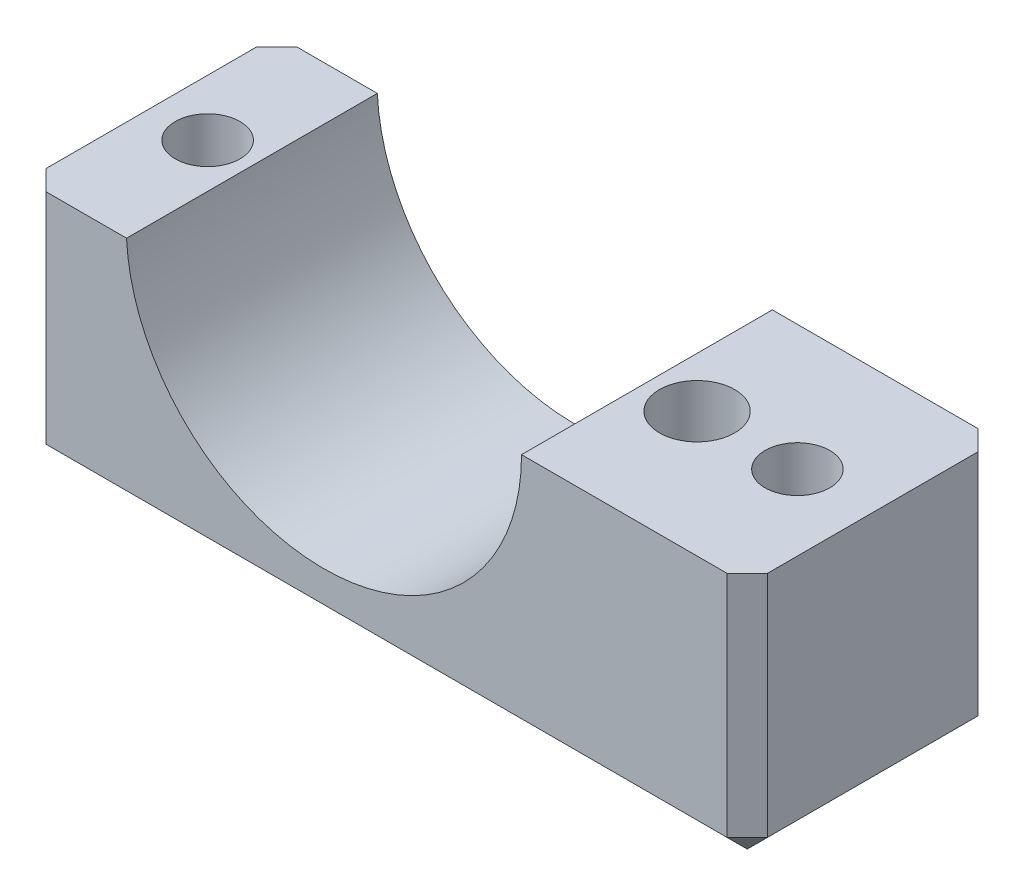
ISO-10303-21;
HEADER;
FILE_DESCRIPTION(('STEP AP214'),'2;1');
FILE_NAME('part.step','',(''),(''),'','','');
FILE_SCHEMA(('AUTOMOTIVE_DESIGN { 1 0 10303 214 1 1 1 1 }'));
ENDSEC;
DATA;
#1=APPLICATION_CONTEXT('core data for automotive mechanical design processes');
#2=APPLICATION_PROTOCOL_DEFINITION('international standard','automotive_design',2000,#1);
#3=PRODUCT_CONTEXT('',#1,'mechanical');
#4=PRODUCT('Part','Part','',(#3));
#5=PRODUCT_RELATED_PRODUCT_CATEGORY('part','',(#4));
#6=PRODUCT_DEFINITION_FORMATION('','',#4);
#7=PRODUCT_DEFINITION_CONTEXT('part definition',#1,'design');
#8=PRODUCT_DEFINITION('design','',#6,#7);
#9=PRODUCT_DEFINITION_SHAPE('','',#8);
#10=(LENGTH_UNIT() NAMED_UNIT(*) SI_UNIT(.MILLI.,.METRE.));
#11=(NAMED_UNIT(*) PLANE_ANGLE_UNIT() SI_UNIT($,.RADIAN.));
#12=(NAMED_UNIT(*) SI_UNIT($,.STERADIAN.) SOLID_ANGLE_UNIT());
#13=UNCERTAINTY_MEASURE_WITH_UNIT(LENGTH_MEASURE(1.E-05),#10,'distance_accuracy_value','');
#14=(GEOMETRIC_REPRESENTATION_CONTEXT(3) GLOBAL_UNCERTAINTY_ASSIGNED_CONTEXT((#13)) GLOBAL_UNIT_ASSIGNED_CONTEXT((#10,
#11,#12)) REPRESENTATION_CONTEXT('',''));
#15=CARTESIAN_POINT('',(0.,0.,0.));
#16=DIRECTION('',(0.,0.,1.));
#17=DIRECTION('',(1.,0.,0.));
#18=AXIS2_PLACEMENT_3D('',#15,#16,#17);
#19=CARTESIAN_POINT('',(0.,-31.496,31.75));
#20=DIRECTION('',(1.,0.,0.));
#21=DIRECTION('',(0.,0.,-1.));
#22=AXIS2_PLACEMENT_3D('',#19,#20,#21);
#23=PLANE('',#22);
#24=DIRECTION('',(0.,0.,1.));
#25=VECTOR('',#24,1.);
#26=CARTESIAN_POINT('',(0.,-28.956,31.75));
#27=LINE('',#26,#25);
#28=CARTESIAN_POINT('',(0.,-28.956,2.53999999999999));
#29=VERTEX_POINT('',#28);
#30=CARTESIAN_POINT('',(0.,-28.956,29.21));
#31=VERTEX_POINT('',#30);
#32=EDGE_CURVE('E211',#29,#31,#27,.T.);
#33=ORIENTED_EDGE('',*,*,#32,.T.);
#34=DIRECTION('',(0.,1.,0.));
#35=VECTOR('',#34,1.);
#36=CARTESIAN_POINT('',(0.,-1.27,29.21));
#37=LINE('',#36,#35);
#38=CARTESIAN_POINT('',(0.,-1.27,29.21));
#39=VERTEX_POINT('',#38);
#40=EDGE_CURVE('E214',#31,#39,#37,.T.);
#41=ORIENTED_EDGE('',*,*,#40,.T.);
#42=DIRECTION('',(0.,0.,1.));
#43=VECTOR('',#42,1.);
#44=CARTESIAN_POINT('',(0.,-1.27,31.75));
#45=LINE('',#44,#43);
#46=CARTESIAN_POINT('',(0.,-1.27,2.53999999999999));
#47=VERTEX_POINT('',#46);
#48=EDGE_CURVE('E149',#47,#39,#45,.T.);
#49=ORIENTED_EDGE('',*,*,#48,.F.);
#50=DIRECTION('',(0.,-1.,0.));
#51=VECTOR('',#50,1.);
#52=CARTESIAN_POINT('',(0.,-31.496,2.53999999999999));
#53=LINE('',#52,#51);
#54=EDGE_CURVE('E209',#47,#29,#53,.T.);
#55=ORIENTED_EDGE('',*,*,#54,.T.);
#56=EDGE_LOOP('',(#33,#41,#49,#55));
#57=FACE_BOUND('',#56,.T.);
#58=ADVANCED_FACE('F41',(#57),#23,.F.);
#59=CARTESIAN_POINT('',(91.313,-31.496,31.75));
#60=DIRECTION('',(0.,1.,0.));
#61=DIRECTION('',(-1.,0.,0.));
#62=AXIS2_PLACEMENT_3D('',#59,#60,#61);
#63=PLANE('',#62);
#64=CARTESIAN_POINT('',(69.088,-31.496,15.875));
#65=DIRECTION('',(0.,-1.,0.));
#66=DIRECTION('',(0.,0.,-1.));
#67=AXIS2_PLACEMENT_3D('',#64,#65,#66);
#68=CIRCLE('',#67,4.76249999999999);
#69=CARTESIAN_POINT('',(69.088,-31.496,11.1125));
#70=VERTEX_POINT('',#69);
#71=EDGE_CURVE('E159',#70,#70,#68,.T.);
#72=ORIENTED_EDGE('',*,*,#71,.F.);
#73=EDGE_LOOP('',(#72));
#74=FACE_BOUND('',#73,.T.);
#75=DIRECTION('',(-1.,0.,0.));
#76=VECTOR('',#75,1.);
#77=CARTESIAN_POINT('',(0.,-31.496,29.21));
#78=LINE('',#77,#76);
#79=CARTESIAN_POINT('',(88.773,-31.496,29.21));
#80=VERTEX_POINT('',#79);
#81=CARTESIAN_POINT('',(2.53999999999999,-31.496,29.21));
#82=VERTEX_POINT('',#81);
#83=EDGE_CURVE('E198',#80,#82,#78,.T.);
#84=ORIENTED_EDGE('',*,*,#83,.T.);
#85=DIRECTION('',(0.,0.,-1.));
#86=VECTOR('',#85,1.);
#87=CARTESIAN_POINT('',(2.53999999999999,-31.496,31.75));
#88=LINE('',#87,#86);
#89=CARTESIAN_POINT('',(2.53999999999999,-31.496,20.2685209012818));
#90=VERTEX_POINT('',#89);
#91=EDGE_CURVE('E200',#82,#90,#88,.T.);
#92=ORIENTED_EDGE('',*,*,#91,.T.);
#93=CARTESIAN_POINT('',(7.12470000000001,-31.496,15.875));
#94=DIRECTION('',(0.,-1.,0.));
#95=DIRECTION('',(0.,0.,-1.));
#96=AXIS2_PLACEMENT_3D('',#93,#94,#95);
#97=CIRCLE('',#96,6.35);
#98=CARTESIAN_POINT('',(2.53999999999999,-31.496,11.4814790987182));
#99=VERTEX_POINT('',#98);
#100=EDGE_CURVE('E272',#99,#90,#97,.T.);
#101=ORIENTED_EDGE('',*,*,#100,.F.);
#102=DIRECTION('',(0.,0.,-1.));
#103=VECTOR('',#102,1.);
#104=CARTESIAN_POINT('',(2.53999999999999,-31.496,31.75));
#105=LINE('',#104,#103);
#106=CARTESIAN_POINT('',(2.53999999999999,-31.496,2.53999999999999));
#107=VERTEX_POINT('',#106);
#108=EDGE_CURVE('E192',#99,#107,#105,.T.);
#109=ORIENTED_EDGE('',*,*,#108,.T.);
#110=DIRECTION('',(1.,0.,0.));
#111=VECTOR('',#110,1.);
#112=CARTESIAN_POINT('',(91.313,-31.496,2.53999999999999));
#113=LINE('',#112,#111);
#114=CARTESIAN_POINT('',(88.773,-31.496,2.53999999999999));
#115=VERTEX_POINT('',#114);
#116=EDGE_CURVE('E189',#107,#115,#113,.T.);
#117=ORIENTED_EDGE('',*,*,#116,.T.);
#118=DIRECTION('',(0.,0.,1.));
#119=VECTOR('',#118,1.);
#120=CARTESIAN_POINT('',(88.773,-31.496,31.75));
#121=LINE('',#120,#119);
#122=EDGE_CURVE('E195',#115,#80,#121,.T.);
#123=ORIENTED_EDGE('',*,*,#122,.T.);
#124=EDGE_LOOP('',(#84,#92,#101,#109,#117,#123));
#125=FACE_BOUND('',#124,.T.);
#126=CARTESIAN_POINT('',(81.788,-31.496,15.875));
#127=DIRECTION('',(0.,-1.,0.));
#128=DIRECTION('',(0.,0.,-1.));
#129=AXIS2_PLACEMENT_3D('',#126,#127,#128);
#130=CIRCLE('',#129,6.34999999999999);
#131=CARTESIAN_POINT('',(81.788,-31.496,9.525));
#132=VERTEX_POINT('',#131);
#133=EDGE_CURVE('E284',#132,#132,#130,.T.);
#134=ORIENTED_EDGE('',*,*,#133,.F.);
#135=EDGE_LOOP('',(#134));
#136=FACE_BOUND('',#135,.T.);
#137=ADVANCED_FACE('F318',(#74,#125,#136),#63,.F.);
#138=CARTESIAN_POINT('',(91.313,0.,31.75));
#139=DIRECTION('',(-1.,0.,0.));
#140=DIRECTION('',(0.,0.,1.));
#141=AXIS2_PLACEMENT_3D('',#138,#139,#140);
#142=PLANE('',#141);
#143=DIRECTION('',(0.,0.,-1.));
#144=VECTOR('',#143,1.);
#145=CARTESIAN_POINT('',(91.313,0.,31.75));
#146=LINE('',#145,#144);
#147=CARTESIAN_POINT('',(91.313,0.,29.21));
#148=VERTEX_POINT('',#147);
#149=CARTESIAN_POINT('',(91.313,0.,2.53999999999999));
#150=VERTEX_POINT('',#149);
#151=EDGE_CURVE('E168',#148,#150,#146,.T.);
#152=ORIENTED_EDGE('',*,*,#151,.F.);
#153=DIRECTION('',(0.,-1.,0.));
#154=VECTOR('',#153,1.);
#155=CARTESIAN_POINT('',(91.313,-31.496,29.21));
#156=LINE('',#155,#154);
#157=CARTESIAN_POINT('',(91.313,-28.956,29.21));
#158=VERTEX_POINT('',#157);
#159=EDGE_CURVE('E187',#148,#158,#156,.T.);
#160=ORIENTED_EDGE('',*,*,#159,.T.);
#161=DIRECTION('',(0.,0.,-1.));
#162=VECTOR('',#161,1.);
#163=CARTESIAN_POINT('',(91.313,-28.956,31.75));
#164=LINE('',#163,#162);
#165=CARTESIAN_POINT('',(91.313,-28.956,2.53999999999999));
#166=VERTEX_POINT('',#165);
#167=EDGE_CURVE('E184',#158,#166,#164,.T.);
#168=ORIENTED_EDGE('',*,*,#167,.T.);
#169=DIRECTION('',(0.,1.,0.));
#170=VECTOR('',#169,1.);
#171=CARTESIAN_POINT('',(91.313,0.,2.53999999999999));
#172=LINE('',#171,#170);
#173=EDGE_CURVE('E180',#166,#150,#172,.T.);
#174=ORIENTED_EDGE('',*,*,#173,.T.);
#175=EDGE_LOOP('',(#152,#160,#168,#174));
#176=FACE_BOUND('',#175,.T.);
#177=ADVANCED_FACE('F320',(#176),#142,.F.);
#178=CARTESIAN_POINT('',(62.738,0.,31.75));
#179=DIRECTION('',(0.,-1.,0.));
#180=DIRECTION('',(0.,0.,-1.));
#181=AXIS2_PLACEMENT_3D('',#178,#179,#180);
#182=PLANE('',#181);
#183=CARTESIAN_POINT('',(69.088,0.,15.875));
#184=DIRECTION('',(0.,-1.,0.));
#185=DIRECTION('',(0.,0.,-1.));
#186=AXIS2_PLACEMENT_3D('',#183,#184,#185);
#187=CIRCLE('',#186,4.76249999999999);
#188=CARTESIAN_POINT('',(69.088,0.,11.1125));
#189=VERTEX_POINT('',#188);
#190=EDGE_CURVE('E269',#189,#189,#187,.T.);
#191=ORIENTED_EDGE('',*,*,#190,.T.);
#192=EDGE_LOOP('',(#191));
#193=FACE_BOUND('',#192,.T.);
#194=CARTESIAN_POINT('',(81.788,0.,15.875));
#195=DIRECTION('',(0.,-1.,0.));
#196=DIRECTION('',(0.,0.,-1.));
#197=AXIS2_PLACEMENT_3D('',#194,#195,#196);
#198=CIRCLE('',#197,4.1021);
#199=CARTESIAN_POINT('',(81.788,0.,11.7729));
#200=VERTEX_POINT('',#199);
#201=EDGE_CURVE('E175',#200,#200,#198,.T.);
#202=ORIENTED_EDGE('',*,*,#201,.T.);
#203=EDGE_LOOP('',(#202));
#204=FACE_BOUND('',#203,.T.);
#205=DIRECTION('',(-1.,0.,0.));
#206=VECTOR('',#205,1.);
#207=CARTESIAN_POINT('',(62.738,0.,31.75));
#208=LINE('',#207,#206);
#209=CARTESIAN_POINT('',(88.773,0.,31.75));
#210=VERTEX_POINT('',#209);
#211=CARTESIAN_POINT('',(62.738,0.,31.75));
#212=VERTEX_POINT('',#211);
#213=EDGE_CURVE('E164',#210,#212,#208,.T.);
#214=ORIENTED_EDGE('',*,*,#213,.F.);
#215=DIRECTION('',(0.707106781186549,0.,-0.707106781186546));
#216=VECTOR('',#215,1.);
#217=CARTESIAN_POINT('',(88.773,0.,31.75));
#218=LINE('',#217,#216);
#219=EDGE_CURVE('E221',#210,#148,#218,.T.);
#220=ORIENTED_EDGE('',*,*,#219,.T.);
#221=ORIENTED_EDGE('',*,*,#151,.T.);
#222=DIRECTION('',(0.707106781186549,0.,0.707106781186546));
#223=VECTOR('',#222,1.);
#224=CARTESIAN_POINT('',(91.313,0.,2.53999999999999));
#225=LINE('',#224,#223);
#226=CARTESIAN_POINT('',(88.773,0.,0.));
#227=VERTEX_POINT('',#226);
#228=EDGE_CURVE('E219',#150,#227,#225,.F.);
#229=ORIENTED_EDGE('',*,*,#228,.T.);
#230=DIRECTION('',(-1.,0.,0.));
#231=VECTOR('',#230,1.);
#232=CARTESIAN_POINT('',(62.738,0.,0.));
#233=LINE('',#232,#231);
#234=CARTESIAN_POINT('',(62.738,0.,0.));
#235=VERTEX_POINT('',#234);
#236=EDGE_CURVE('E173',#227,#235,#233,.T.);
#237=ORIENTED_EDGE('',*,*,#236,.T.);
#238=DIRECTION('',(0.,0.,-1.));
#239=VECTOR('',#238,1.);
#240=CARTESIAN_POINT('',(62.738,0.,31.75));
#241=LINE('',#240,#239);
#242=EDGE_CURVE('E166',#212,#235,#241,.T.);
#243=ORIENTED_EDGE('',*,*,#242,.F.);
#244=EDGE_LOOP('',(#214,#220,#221,#229,#237,#243));
#245=FACE_BOUND('',#244,.T.);
#246=ADVANCED_FACE('F295',(#193,#204,#245),#182,.F.);
#247=CARTESIAN_POINT('',(37.719,0.,31.75));
#248=DIRECTION('',(0.,0.,-1.));
#249=DIRECTION('',(-1.,0.,0.));
#250=AXIS2_PLACEMENT_3D('',#247,#248,#249);
#251=CYLINDRICAL_SURFACE('',#250,25.019);
#252=CARTESIAN_POINT('',(37.719,0.,0.));
#253=DIRECTION('',(0.,0.,-1.));
#254=DIRECTION('',(1.,0.,0.));
#255=AXIS2_PLACEMENT_3D('',#252,#253,#254);
#256=CIRCLE('',#255,25.019);
#257=CARTESIAN_POINT('',(12.7322542935259,-1.27,0.));
#258=VERTEX_POINT('',#257);
#259=EDGE_CURVE('E158',#235,#258,#256,.T.);
#260=ORIENTED_EDGE('',*,*,#259,.T.);
#261=DIRECTION('',(0.,0.,-1.));
#262=VECTOR('',#261,1.);
#263=CARTESIAN_POINT('',(12.7322542935259,-1.27,31.75));
#264=LINE('',#263,#262);
#265=CARTESIAN_POINT('',(12.7322542935259,-1.27,31.75));
#266=VERTEX_POINT('',#265);
#267=EDGE_CURVE('E141',#258,#266,#264,.F.);
#268=ORIENTED_EDGE('',*,*,#267,.T.);
#269=CARTESIAN_POINT('',(37.719,0.,31.75));
#270=DIRECTION('',(0.,0.,-1.));
#271=DIRECTION('',(1.,0.,0.));
#272=AXIS2_PLACEMENT_3D('',#269,#270,#271);
#273=CIRCLE('',#272,25.019);
#274=EDGE_CURVE('E156',#212,#266,#273,.T.);
#275=ORIENTED_EDGE('',*,*,#274,.F.);
#276=ORIENTED_EDGE('',*,*,#242,.T.);
#277=EDGE_LOOP('',(#260,#268,#275,#276));
#278=FACE_BOUND('',#277,.T.);
#279=ADVANCED_FACE('F154',(#278),#251,.F.);
#280=CARTESIAN_POINT('',(37.719,0.,31.75));
#281=DIRECTION('',(0.,0.,1.));
#282=DIRECTION('',(1.,0.,0.));
#283=AXIS2_PLACEMENT_3D('',#280,#281,#282);
#284=PLANE('',#283);
#285=DIRECTION('',(1.,0.,0.));
#286=VECTOR('',#285,1.);
#287=CARTESIAN_POINT('',(0.,-1.27,31.75));
#288=LINE('',#287,#286);
#289=CARTESIAN_POINT('',(2.53999999999999,-1.27,31.75));
#290=VERTEX_POINT('',#289);
#291=EDGE_CURVE('E136',#290,#266,#288,.T.);
#292=ORIENTED_EDGE('',*,*,#291,.F.);
#293=DIRECTION('',(0.,-1.,0.));
#294=VECTOR('',#293,1.);
#295=CARTESIAN_POINT('',(2.53999999999999,-31.496,31.75));
#296=LINE('',#295,#294);
#297=CARTESIAN_POINT('',(2.53999999999999,-28.956,31.75));
#298=VERTEX_POINT('',#297);
#299=EDGE_CURVE('E207',#290,#298,#296,.T.);
#300=ORIENTED_EDGE('',*,*,#299,.T.);
#301=DIRECTION('',(1.,0.,0.));
#302=VECTOR('',#301,1.);
#303=CARTESIAN_POINT('',(91.313,-28.956,31.75));
#304=LINE('',#303,#302);
#305=CARTESIAN_POINT('',(88.773,-28.956,31.75));
#306=VERTEX_POINT('',#305);
#307=EDGE_CURVE('E203',#298,#306,#304,.T.);
#308=ORIENTED_EDGE('',*,*,#307,.T.);
#309=DIRECTION('',(0.,1.,0.));
#310=VECTOR('',#309,1.);
#311=CARTESIAN_POINT('',(88.773,0.,31.75));
#312=LINE('',#311,#310);
#313=EDGE_CURVE('E205',#306,#210,#312,.T.);
#314=ORIENTED_EDGE('',*,*,#313,.T.);
#315=ORIENTED_EDGE('',*,*,#213,.T.);
#316=ORIENTED_EDGE('',*,*,#274,.T.);
#317=EDGE_LOOP('',(#292,#300,#308,#314,#315,#316));
#318=FACE_BOUND('',#317,.T.);
#319=ADVANCED_FACE('F162',(#318),#284,.T.);
#320=CARTESIAN_POINT('',(37.719,0.,0.));
#321=DIRECTION('',(0.,0.,1.));
#322=DIRECTION('',(1.,0.,0.));
#323=AXIS2_PLACEMENT_3D('',#320,#321,#322);
#324=PLANE('',#323);
#325=DIRECTION('',(-1.,0.,0.));
#326=VECTOR('',#325,1.);
#327=CARTESIAN_POINT('',(37.719,-28.956,0.));
#328=LINE('',#327,#326);
#329=CARTESIAN_POINT('',(88.773,-28.956,0.));
#330=VERTEX_POINT('',#329);
#331=CARTESIAN_POINT('',(2.54,-28.956,0.));
#332=VERTEX_POINT('',#331);
#333=EDGE_CURVE('E50',#330,#332,#328,.T.);
#334=ORIENTED_EDGE('',*,*,#333,.T.);
#335=DIRECTION('',(0.,1.,0.));
#336=VECTOR('',#335,1.);
#337=CARTESIAN_POINT('',(2.54,0.,0.));
#338=LINE('',#337,#336);
#339=CARTESIAN_POINT('',(2.54,-1.27,0.));
#340=VERTEX_POINT('',#339);
#341=EDGE_CURVE('E11',#332,#340,#338,.T.);
#342=ORIENTED_EDGE('',*,*,#341,.T.);
#343=DIRECTION('',(-1.,0.,0.));
#344=VECTOR('',#343,1.);
#345=CARTESIAN_POINT('',(0.,-1.27,0.));
#346=LINE('',#345,#344);
#347=EDGE_CURVE('E148',#258,#340,#346,.T.);
#348=ORIENTED_EDGE('',*,*,#347,.F.);
#349=ORIENTED_EDGE('',*,*,#259,.F.);
#350=ORIENTED_EDGE('',*,*,#236,.F.);
#351=DIRECTION('',(0.,-1.,0.));
#352=VECTOR('',#351,1.);
#353=CARTESIAN_POINT('',(88.773,0.,0.));
#354=LINE('',#353,#352);
#355=EDGE_CURVE('E61',#227,#330,#354,.T.);
#356=ORIENTED_EDGE('',*,*,#355,.T.);
#357=EDGE_LOOP('',(#334,#342,#348,#349,#350,#356));
#358=FACE_BOUND('',#357,.T.);
#359=ADVANCED_FACE('F302',(#358),#324,.F.);
#360=CARTESIAN_POINT('',(81.788,-31.496,15.875));
#361=DIRECTION('',(0.,-1.,0.));
#362=DIRECTION('',(0.,0.,-1.));
#363=AXIS2_PLACEMENT_3D('',#360,#361,#362);
#364=CYLINDRICAL_SURFACE('',#363,4.1021);
#365=ORIENTED_EDGE('',*,*,#201,.F.);
#366=EDGE_LOOP('',(#365));
#367=FACE_BOUND('',#366,.T.);
#368=CARTESIAN_POINT('',(81.788,-21.971,15.875));
#369=DIRECTION('',(0.,-1.,0.));
#370=DIRECTION('',(0.,0.,-1.));
#371=AXIS2_PLACEMENT_3D('',#368,#369,#370);
#372=CIRCLE('',#371,4.1021);
#373=CARTESIAN_POINT('',(81.788,-21.971,11.7729));
#374=VERTEX_POINT('',#373);
#375=EDGE_CURVE('E290',#374,#374,#372,.T.);
#376=ORIENTED_EDGE('',*,*,#375,.T.);
#377=EDGE_LOOP('',(#376));
#378=FACE_BOUND('',#377,.T.);
#379=ADVANCED_FACE('F298',(#367,#378),#364,.F.);
#380=CARTESIAN_POINT('',(85.8901,-21.971,15.875));
#381=DIRECTION('',(0.,1.,0.));
#382=DIRECTION('',(0.,0.,1.));
#383=AXIS2_PLACEMENT_3D('',#380,#381,#382);
#384=PLANE('',#383);
#385=ORIENTED_EDGE('',*,*,#375,.F.);
#386=EDGE_LOOP('',(#385));
#387=FACE_BOUND('',#386,.T.);
#388=CARTESIAN_POINT('',(81.788,-21.971,15.875));
#389=DIRECTION('',(0.,-1.,0.));
#390=DIRECTION('',(0.,0.,-1.));
#391=AXIS2_PLACEMENT_3D('',#388,#389,#390);
#392=CIRCLE('',#391,6.34999999999999);
#393=CARTESIAN_POINT('',(81.788,-21.971,9.525));
#394=VERTEX_POINT('',#393);
#395=EDGE_CURVE('E287',#394,#394,#392,.T.);
#396=ORIENTED_EDGE('',*,*,#395,.T.);
#397=EDGE_LOOP('',(#396));
#398=FACE_BOUND('',#397,.T.);
#399=ADVANCED_FACE('F301',(#387,#398),#384,.F.);
#400=CARTESIAN_POINT('',(81.788,-31.496,15.875));
#401=DIRECTION('',(0.,-1.,0.));
#402=DIRECTION('',(0.,0.,-1.));
#403=AXIS2_PLACEMENT_3D('',#400,#401,#402);
#404=CYLINDRICAL_SURFACE('',#403,6.34999999999999);
#405=ORIENTED_EDGE('',*,*,#395,.F.);
#406=EDGE_LOOP('',(#405));
#407=FACE_BOUND('',#406,.T.);
#408=ORIENTED_EDGE('',*,*,#133,.T.);
#409=EDGE_LOOP('',(#408));
#410=FACE_BOUND('',#409,.T.);
#411=ADVANCED_FACE('F308',(#407,#410),#404,.F.);
#412=CARTESIAN_POINT('',(7.12470000000001,-31.496,15.875));
#413=DIRECTION('',(0.,-1.,0.));
#414=DIRECTION('',(0.,0.,-1.));
#415=AXIS2_PLACEMENT_3D('',#412,#413,#414);
#416=CYLINDRICAL_SURFACE('',#415,4.1021);
#417=CARTESIAN_POINT('',(7.12470000000001,-1.27,15.875));
#418=DIRECTION('',(0.,-1.,0.));
#419=DIRECTION('',(0.,0.,-1.));
#420=AXIS2_PLACEMENT_3D('',#417,#418,#419);
#421=CIRCLE('',#420,4.1021);
#422=CARTESIAN_POINT('',(7.12470000000001,-1.27,11.7729));
#423=VERTEX_POINT('',#422);
#424=EDGE_CURVE('E160',#423,#423,#421,.F.);
#425=ORIENTED_EDGE('',*,*,#424,.T.);
#426=EDGE_LOOP('',(#425));
#427=FACE_BOUND('',#426,.T.);
#428=CARTESIAN_POINT('',(7.12470000000001,-21.971,15.875));
#429=DIRECTION('',(0.,-1.,0.));
#430=DIRECTION('',(0.,0.,-1.));
#431=AXIS2_PLACEMENT_3D('',#428,#429,#430);
#432=CIRCLE('',#431,4.1021);
#433=CARTESIAN_POINT('',(7.12470000000001,-21.971,11.7729));
#434=VERTEX_POINT('',#433);
#435=EDGE_CURVE('E280',#434,#434,#432,.T.);
#436=ORIENTED_EDGE('',*,*,#435,.T.);
#437=EDGE_LOOP('',(#436));
#438=FACE_BOUND('',#437,.T.);
#439=ADVANCED_FACE('F314',(#427,#438),#416,.F.);
#440=CARTESIAN_POINT('',(11.2268,-21.971,15.875));
#441=DIRECTION('',(0.,1.,0.));
#442=DIRECTION('',(0.,0.,1.));
#443=AXIS2_PLACEMENT_3D('',#440,#441,#442);
#444=PLANE('',#443);
#445=ORIENTED_EDGE('',*,*,#435,.F.);
#446=EDGE_LOOP('',(#445));
#447=FACE_BOUND('',#446,.T.);
#448=CARTESIAN_POINT('',(7.12470000000001,-21.971,15.875));
#449=DIRECTION('',(0.,-1.,0.));
#450=DIRECTION('',(0.,0.,-1.));
#451=AXIS2_PLACEMENT_3D('',#448,#449,#450);
#452=CIRCLE('',#451,6.35);
#453=CARTESIAN_POINT('',(7.12470000000001,-21.971,9.525));
#454=VERTEX_POINT('',#453);
#455=EDGE_CURVE('E276',#454,#454,#452,.T.);
#456=ORIENTED_EDGE('',*,*,#455,.T.);
#457=EDGE_LOOP('',(#456));
#458=FACE_BOUND('',#457,.T.);
#459=ADVANCED_FACE('F395',(#447,#458),#444,.F.);
#460=CARTESIAN_POINT('',(7.12470000000001,-31.496,15.875));
#461=DIRECTION('',(0.,-1.,0.));
#462=DIRECTION('',(0.,0.,-1.));
#463=AXIS2_PLACEMENT_3D('',#460,#461,#462);
#464=CYLINDRICAL_SURFACE('',#463,6.35);
#465=ORIENTED_EDGE('',*,*,#455,.F.);
#466=EDGE_LOOP('',(#465));
#467=FACE_BOUND('',#466,.T.);
#468=ORIENTED_EDGE('',*,*,#100,.T.);
#469=CARTESIAN_POINT('',(7.12470000000001,-36.0807,15.875));
#470=DIRECTION('',(0.707106781186549,0.707106781186546,0.));
#471=DIRECTION('',(0.707106781186546,-0.707106781186549,0.));
#472=AXIS2_PLACEMENT_3D('',#469,#470,#471);
#473=ELLIPSE('',#472,8.98025612106918,6.35);
#474=EDGE_CURVE('E223',#90,#99,#473,.F.);
#475=ORIENTED_EDGE('',*,*,#474,.T.);
#476=EDGE_LOOP('',(#468,#475));
#477=FACE_BOUND('',#476,.T.);
#478=ADVANCED_FACE('F392',(#467,#477),#464,.F.);
#479=CARTESIAN_POINT('',(69.088,-31.496,15.875));
#480=DIRECTION('',(0.,-1.,0.));
#481=DIRECTION('',(0.,0.,-1.));
#482=AXIS2_PLACEMENT_3D('',#479,#480,#481);
#483=CYLINDRICAL_SURFACE('',#482,4.76249999999999);
#484=ORIENTED_EDGE('',*,*,#190,.F.);
#485=EDGE_LOOP('',(#484));
#486=FACE_BOUND('',#485,.T.);
#487=ORIENTED_EDGE('',*,*,#71,.T.);
#488=EDGE_LOOP('',(#487));
#489=FACE_BOUND('',#488,.T.);
#490=ADVANCED_FACE('F394',(#486,#489),#483,.F.);
#491=CARTESIAN_POINT('',(0.,-1.27,0.));
#492=DIRECTION('',(0.,-1.,0.));
#493=DIRECTION('',(0.,0.,-1.));
#494=AXIS2_PLACEMENT_3D('',#491,#492,#493);
#495=PLANE('',#494);
#496=ORIENTED_EDGE('',*,*,#424,.F.);
#497=EDGE_LOOP('',(#496));
#498=FACE_BOUND('',#497,.T.);
#499=ORIENTED_EDGE('',*,*,#48,.T.);
#500=DIRECTION('',(0.707106781186546,0.,0.707106781186549));
#501=VECTOR('',#500,1.);
#502=CARTESIAN_POINT('',(2.53999999999999,-1.27,31.75));
#503=LINE('',#502,#501);
#504=EDGE_CURVE('E144',#39,#290,#503,.T.);
#505=ORIENTED_EDGE('',*,*,#504,.T.);
#506=ORIENTED_EDGE('',*,*,#291,.T.);
#507=ORIENTED_EDGE('',*,*,#267,.F.);
#508=ORIENTED_EDGE('',*,*,#347,.T.);
#509=DIRECTION('',(0.707106781186549,0.,-0.707106781186546));
#510=VECTOR('',#509,1.);
#511=CARTESIAN_POINT('',(0.,-1.27,2.53999999999999));
#512=LINE('',#511,#510);
#513=EDGE_CURVE('E216',#340,#47,#512,.F.);
#514=ORIENTED_EDGE('',*,*,#513,.T.);
#515=EDGE_LOOP('',(#499,#505,#506,#507,#508,#514));
#516=FACE_BOUND('',#515,.T.);
#517=ADVANCED_FACE('F139',(#498,#516),#495,.F.);
#518=CARTESIAN_POINT('',(2.53999999999999,0.,31.75));
#519=DIRECTION('',(-0.707106781186549,0.,0.707106781186546));
#520=DIRECTION('',(0.,1.,0.));
#521=AXIS2_PLACEMENT_3D('',#518,#519,#520);
#522=PLANE('',#521);
#523=ORIENTED_EDGE('',*,*,#504,.F.);
#524=ORIENTED_EDGE('',*,*,#40,.F.);
#525=DIRECTION('',(-0.707106781186546,0.,-0.707106781186549));
#526=VECTOR('',#525,1.);
#527=CARTESIAN_POINT('',(2.53999999999999,-28.956,31.75));
#528=LINE('',#527,#526);
#529=EDGE_CURVE('E256',#298,#31,#528,.T.);
#530=ORIENTED_EDGE('',*,*,#529,.F.);
#531=ORIENTED_EDGE('',*,*,#299,.F.);
#532=EDGE_LOOP('',(#523,#524,#530,#531));
#533=FACE_BOUND('',#532,.T.);
#534=ADVANCED_FACE('F43',(#533),#522,.T.);
#535=CARTESIAN_POINT('',(0.,-31.496,2.53999999999999));
#536=DIRECTION('',(0.707106781186546,0.,0.707106781186549));
#537=DIRECTION('',(0.,-1.,0.));
#538=AXIS2_PLACEMENT_3D('',#535,#536,#537);
#539=PLANE('',#538);
#540=ORIENTED_EDGE('',*,*,#513,.F.);
#541=ORIENTED_EDGE('',*,*,#341,.F.);
#542=DIRECTION('',(-0.707106781186549,0.,0.707106781186545));
#543=VECTOR('',#542,1.);
#544=CARTESIAN_POINT('',(1.27,-28.956,1.26999999999999));
#545=LINE('',#544,#543);
#546=EDGE_CURVE('E254',#29,#332,#545,.F.);
#547=ORIENTED_EDGE('',*,*,#546,.F.);
#548=ORIENTED_EDGE('',*,*,#54,.F.);
#549=EDGE_LOOP('',(#540,#541,#547,#548));
#550=FACE_BOUND('',#549,.T.);
#551=ADVANCED_FACE('F372',(#550),#539,.F.);
#552=CARTESIAN_POINT('',(2.53999999999999,-31.496,31.75));
#553=DIRECTION('',(0.707106781186549,0.707106781186546,0.));
#554=DIRECTION('',(0.,0.,-1.));
#555=AXIS2_PLACEMENT_3D('',#552,#553,#554);
#556=PLANE('',#555);
#557=DIRECTION('',(-0.707106781186546,0.707106781186549,0.));
#558=VECTOR('',#557,1.);
#559=CARTESIAN_POINT('',(1.26999999999999,-30.226,29.21));
#560=LINE('',#559,#558);
#561=EDGE_CURVE('E45',#31,#82,#560,.F.);
#562=ORIENTED_EDGE('',*,*,#561,.F.);
#563=ORIENTED_EDGE('',*,*,#32,.F.);
#564=DIRECTION('',(0.707106781186545,-0.707106781186549,0.));
#565=VECTOR('',#564,1.);
#566=CARTESIAN_POINT('',(2.53999999999999,-31.496,2.53999999999999));
#567=LINE('',#566,#565);
#568=EDGE_CURVE('E251',#107,#29,#567,.F.);
#569=ORIENTED_EDGE('',*,*,#568,.F.);
#570=ORIENTED_EDGE('',*,*,#108,.F.);
#571=ORIENTED_EDGE('',*,*,#474,.F.);
#572=ORIENTED_EDGE('',*,*,#91,.F.);
#573=EDGE_LOOP('',(#562,#563,#569,#570,#571,#572));
#574=FACE_BOUND('',#573,.T.);
#575=ADVANCED_FACE('F370',(#574),#556,.F.);
#576=CARTESIAN_POINT('',(2.53999999999999,-28.956,31.75));
#577=DIRECTION('',(-0.577350269189629,-0.577350269189626,0.577350269189623));
#578=DIRECTION('',(0.707106781186545,-0.707106781186549,0.));
#579=AXIS2_PLACEMENT_3D('',#576,#577,#578);
#580=PLANE('',#579);
#581=ORIENTED_EDGE('',*,*,#529,.T.);
#582=ORIENTED_EDGE('',*,*,#561,.T.);
#583=DIRECTION('',(0.,0.707106781186546,0.707106781186549));
#584=VECTOR('',#583,1.);
#585=CARTESIAN_POINT('',(2.53999999999998,-28.956,31.75));
#586=LINE('',#585,#584);
#587=EDGE_CURVE('E248',#298,#82,#586,.F.);
#588=ORIENTED_EDGE('',*,*,#587,.F.);
#589=EDGE_LOOP('',(#581,#582,#588));
#590=FACE_BOUND('',#589,.T.);
#591=ADVANCED_FACE('F366',(#590),#580,.T.);
#592=CARTESIAN_POINT('',(2.53999999999999,-31.496,2.53999999999999));
#593=DIRECTION('',(-0.577350269189626,-0.577350269189623,-0.577350269189629));
#594=DIRECTION('',(-0.707106781186549,0.,0.707106781186546));
#595=AXIS2_PLACEMENT_3D('',#592,#593,#594);
#596=PLANE('',#595);
#597=ORIENTED_EDGE('',*,*,#568,.T.);
#598=ORIENTED_EDGE('',*,*,#546,.T.);
#599=DIRECTION('',(0.,0.70710678118655,-0.707106781186545));
#600=VECTOR('',#599,1.);
#601=CARTESIAN_POINT('',(2.53999999999999,-31.496,2.53999999999999));
#602=LINE('',#601,#600);
#603=EDGE_CURVE('E245',#107,#332,#602,.T.);
#604=ORIENTED_EDGE('',*,*,#603,.F.);
#605=EDGE_LOOP('',(#597,#598,#604));
#606=FACE_BOUND('',#605,.T.);
#607=ADVANCED_FACE('F362',(#606),#596,.T.);
#608=CARTESIAN_POINT('',(37.719,-28.956,31.75));
#609=DIRECTION('',(0.,-0.707106781186549,0.707106781186546));
#610=DIRECTION('',(-1.,0.,0.));
#611=AXIS2_PLACEMENT_3D('',#608,#609,#610);
#612=PLANE('',#611);
#613=ORIENTED_EDGE('',*,*,#587,.T.);
#614=ORIENTED_EDGE('',*,*,#83,.F.);
#615=DIRECTION('',(0.,-0.707106781186546,-0.707106781186549));
#616=VECTOR('',#615,1.);
#617=CARTESIAN_POINT('',(88.773,-31.496,29.21));
#618=LINE('',#617,#616);
#619=EDGE_CURVE('E242',#306,#80,#618,.T.);
#620=ORIENTED_EDGE('',*,*,#619,.F.);
#621=ORIENTED_EDGE('',*,*,#307,.F.);
#622=EDGE_LOOP('',(#613,#614,#620,#621));
#623=FACE_BOUND('',#622,.T.);
#624=ADVANCED_FACE('F358',(#623),#612,.T.);
#625=CARTESIAN_POINT('',(88.773,0.,31.75));
#626=DIRECTION('',(0.707106781186546,0.,0.707106781186549));
#627=DIRECTION('',(0.,-1.,0.));
#628=AXIS2_PLACEMENT_3D('',#625,#626,#627);
#629=PLANE('',#628);
#630=ORIENTED_EDGE('',*,*,#219,.F.);
#631=ORIENTED_EDGE('',*,*,#313,.F.);
#632=DIRECTION('',(-0.707106781186549,0.,0.707106781186545));
#633=VECTOR('',#632,1.);
#634=CARTESIAN_POINT('',(90.043,-28.956,30.48));
#635=LINE('',#634,#633);
#636=EDGE_CURVE('E239',#158,#306,#635,.T.);
#637=ORIENTED_EDGE('',*,*,#636,.F.);
#638=ORIENTED_EDGE('',*,*,#159,.F.);
#639=EDGE_LOOP('',(#630,#631,#637,#638));
#640=FACE_BOUND('',#639,.T.);
#641=ADVANCED_FACE('F354',(#640),#629,.T.);
#642=CARTESIAN_POINT('',(91.313,0.,2.53999999999999));
#643=DIRECTION('',(-0.707106781186546,0.,0.707106781186549));
#644=DIRECTION('',(0.,1.,0.));
#645=AXIS2_PLACEMENT_3D('',#642,#643,#644);
#646=PLANE('',#645);
#647=ORIENTED_EDGE('',*,*,#228,.F.);
#648=ORIENTED_EDGE('',*,*,#173,.F.);
#649=DIRECTION('',(-0.707106781186549,0.,-0.707106781186546));
#650=VECTOR('',#649,1.);
#651=CARTESIAN_POINT('',(91.313,-28.956,2.53999999999999));
#652=LINE('',#651,#650);
#653=EDGE_CURVE('E236',#330,#166,#652,.F.);
#654=ORIENTED_EDGE('',*,*,#653,.F.);
#655=ORIENTED_EDGE('',*,*,#355,.F.);
#656=EDGE_LOOP('',(#647,#648,#654,#655));
#657=FACE_BOUND('',#656,.T.);
#658=ADVANCED_FACE('F350',(#657),#646,.F.);
#659=CARTESIAN_POINT('',(91.313,-31.496,2.53999999999999));
#660=DIRECTION('',(0.,0.707106781186545,0.70710678118655));
#661=DIRECTION('',(1.,0.,0.));
#662=AXIS2_PLACEMENT_3D('',#659,#660,#661);
#663=PLANE('',#662);
#664=ORIENTED_EDGE('',*,*,#603,.T.);
#665=ORIENTED_EDGE('',*,*,#333,.F.);
#666=DIRECTION('',(0.,-0.70710678118655,0.707106781186545));
#667=VECTOR('',#666,1.);
#668=CARTESIAN_POINT('',(88.773,-30.226,1.26999999999999));
#669=LINE('',#668,#667);
#670=EDGE_CURVE('E233',#115,#330,#669,.F.);
#671=ORIENTED_EDGE('',*,*,#670,.F.);
#672=ORIENTED_EDGE('',*,*,#116,.F.);
#673=EDGE_LOOP('',(#664,#665,#671,#672));
#674=FACE_BOUND('',#673,.T.);
#675=ADVANCED_FACE('F346',(#674),#663,.F.);
#676=CARTESIAN_POINT('',(88.773,-31.496,29.21));
#677=DIRECTION('',(0.577350269189623,-0.577350269189629,0.577350269189626));
#678=DIRECTION('',(0.,-0.707106781186546,-0.707106781186549));
#679=AXIS2_PLACEMENT_3D('',#676,#677,#678);
#680=PLANE('',#679);
#681=ORIENTED_EDGE('',*,*,#636,.T.);
#682=ORIENTED_EDGE('',*,*,#619,.T.);
#683=DIRECTION('',(-0.707106781186549,-0.707106781186546,0.));
#684=VECTOR('',#683,1.);
#685=CARTESIAN_POINT('',(88.773,-31.496,29.21));
#686=LINE('',#685,#684);
#687=EDGE_CURVE('E231',#158,#80,#686,.T.);
#688=ORIENTED_EDGE('',*,*,#687,.F.);
#689=EDGE_LOOP('',(#681,#682,#688));
#690=FACE_BOUND('',#689,.T.);
#691=ADVANCED_FACE('F342',(#690),#680,.T.);
#692=CARTESIAN_POINT('',(91.313,-28.956,2.53999999999999));
#693=DIRECTION('',(0.577350269189623,-0.577350269189626,-0.577350269189629));
#694=DIRECTION('',(0.,0.707106781186549,-0.707106781186545));
#695=AXIS2_PLACEMENT_3D('',#692,#693,#694);
#696=PLANE('',#695);
#697=ORIENTED_EDGE('',*,*,#670,.T.);
#698=ORIENTED_EDGE('',*,*,#653,.T.);
#699=DIRECTION('',(0.707106781186549,0.707106781186545,0.));
#700=VECTOR('',#699,1.);
#701=CARTESIAN_POINT('',(91.313,-28.956,2.53999999999999));
#702=LINE('',#701,#700);
#703=EDGE_CURVE('E229',#115,#166,#702,.T.);
#704=ORIENTED_EDGE('',*,*,#703,.F.);
#705=EDGE_LOOP('',(#697,#698,#704));
#706=FACE_BOUND('',#705,.T.);
#707=ADVANCED_FACE('F338',(#706),#696,.T.);
#708=CARTESIAN_POINT('',(91.313,-28.956,31.75));
#709=DIRECTION('',(-0.707106781186546,0.707106781186549,0.));
#710=DIRECTION('',(0.,0.,-1.));
#711=AXIS2_PLACEMENT_3D('',#708,#709,#710);
#712=PLANE('',#711);
#713=ORIENTED_EDGE('',*,*,#687,.T.);
#714=ORIENTED_EDGE('',*,*,#122,.F.);
#715=ORIENTED_EDGE('',*,*,#703,.T.);
#716=ORIENTED_EDGE('',*,*,#167,.F.);
#717=EDGE_LOOP('',(#713,#714,#715,#716));
#718=FACE_BOUND('',#717,.T.);
#719=ADVANCED_FACE('F335',(#718),#712,.F.);
#720=CLOSED_SHELL('',(#58,#137,#177,#246,#279,#319,#359,#379,#399,#411,#439,#459,#478,#490,#517,
#534,#551,#575,#591,#607,#624,#641,#658,#675,#691,#707,#719));
#721=MANIFOLD_SOLID_BREP('B2',#720);
#722=ADVANCED_BREP_SHAPE_REPRESENTATION('',(#18,#721),#14);
#723=SHAPE_DEFINITION_REPRESENTATION(#9,#722);
ENDSEC;
END-ISO-10303-21;
